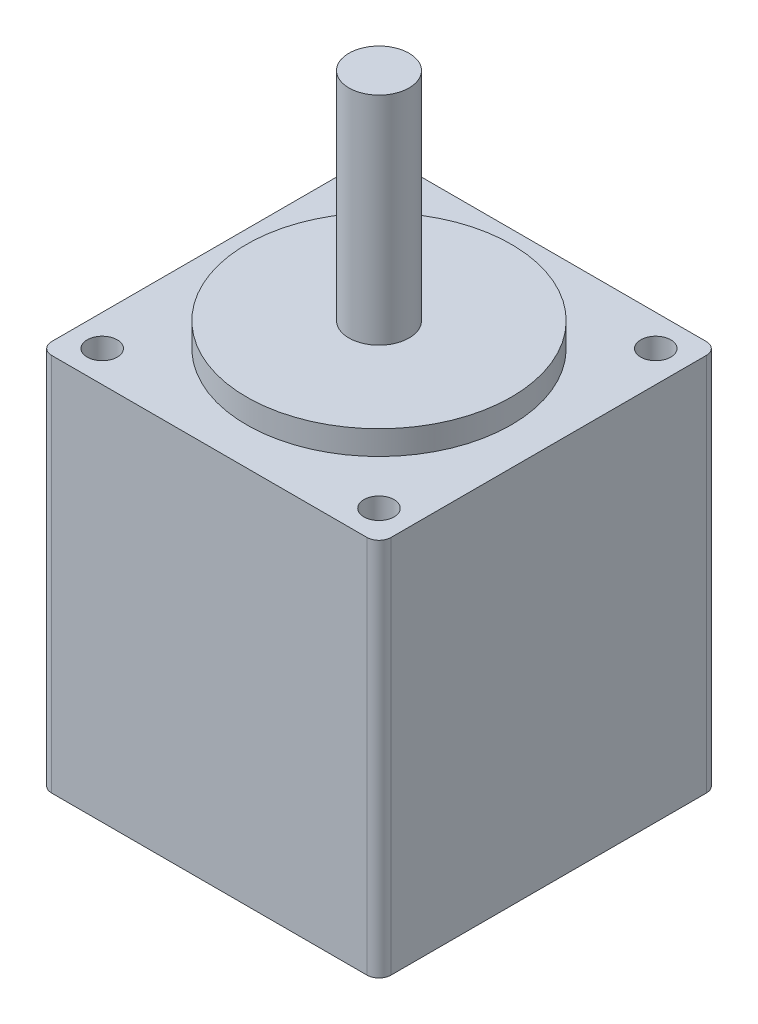
ISO-10303-21;
HEADER;
FILE_DESCRIPTION(('STEP AP214'),'2;1');
FILE_NAME('part.step','',(''),(''),'','','');
FILE_SCHEMA(('AUTOMOTIVE_DESIGN { 1 0 10303 214 1 1 1 1 }'));
ENDSEC;
DATA;
#1=APPLICATION_CONTEXT('core data for automotive mechanical design processes');
#2=APPLICATION_PROTOCOL_DEFINITION('international standard','automotive_design',2000,#1);
#3=PRODUCT_CONTEXT('',#1,'mechanical');
#4=PRODUCT('Part','Part','',(#3));
#5=PRODUCT_RELATED_PRODUCT_CATEGORY('part','',(#4));
#6=PRODUCT_DEFINITION_FORMATION('','',#4);
#7=PRODUCT_DEFINITION_CONTEXT('part definition',#1,'design');
#8=PRODUCT_DEFINITION('design','',#6,#7);
#9=PRODUCT_DEFINITION_SHAPE('','',#8);
#10=(LENGTH_UNIT() NAMED_UNIT(*) SI_UNIT(.MILLI.,.METRE.));
#11=(NAMED_UNIT(*) PLANE_ANGLE_UNIT() SI_UNIT($,.RADIAN.));
#12=(NAMED_UNIT(*) SI_UNIT($,.STERADIAN.) SOLID_ANGLE_UNIT());
#13=UNCERTAINTY_MEASURE_WITH_UNIT(LENGTH_MEASURE(1.E-05),#10,'distance_accuracy_value','');
#14=(GEOMETRIC_REPRESENTATION_CONTEXT(3) GLOBAL_UNCERTAINTY_ASSIGNED_CONTEXT((#13)) GLOBAL_UNIT_ASSIGNED_CONTEXT((#10,
#11,#12)) REPRESENTATION_CONTEXT('',''));
#15=CARTESIAN_POINT('',(0.,0.,0.));
#16=DIRECTION('',(0.,0.,1.));
#17=DIRECTION('',(1.,0.,0.));
#18=AXIS2_PLACEMENT_3D('',#15,#16,#17);
#19=CARTESIAN_POINT('',(0.,31.5,0.));
#20=DIRECTION('',(0.,1.,0.));
#21=DIRECTION('',(1.,0.,0.));
#22=AXIS2_PLACEMENT_3D('',#19,#20,#21);
#23=PLANE('',#22);
#24=CARTESIAN_POINT('',(0.,31.5,0.));
#25=DIRECTION('',(0.,-1.,0.));
#26=DIRECTION('',(-1.,0.,0.));
#27=AXIS2_PLACEMENT_3D('',#24,#25,#26);
#28=CIRCLE('',#27,11.);
#29=CARTESIAN_POINT('',(11.,31.5,0.));
#30=VERTEX_POINT('',#29);
#31=EDGE_CURVE('E199',#30,#30,#28,.T.);
#32=ORIENTED_EDGE('',*,*,#31,.T.);
#33=EDGE_LOOP('',(#32));
#34=FACE_BOUND('',#33,.T.);
#35=CARTESIAN_POINT('',(-11.5,31.5,11.5));
#36=DIRECTION('',(0.,-1.,0.));
#37=DIRECTION('',(-1.,0.,0.));
#38=AXIS2_PLACEMENT_3D('',#35,#36,#37);
#39=CIRCLE('',#38,1.25);
#40=CARTESIAN_POINT('',(-10.25,31.5,11.5));
#41=VERTEX_POINT('',#40);
#42=EDGE_CURVE('E268',#41,#41,#39,.T.);
#43=ORIENTED_EDGE('',*,*,#42,.T.);
#44=EDGE_LOOP('',(#43));
#45=FACE_BOUND('',#44,.T.);
#46=CARTESIAN_POINT('',(11.5,31.5,11.5));
#47=DIRECTION('',(0.,-1.,0.));
#48=DIRECTION('',(-1.,0.,0.));
#49=AXIS2_PLACEMENT_3D('',#46,#47,#48);
#50=CIRCLE('',#49,1.25);
#51=CARTESIAN_POINT('',(12.75,31.5,11.5));
#52=VERTEX_POINT('',#51);
#53=EDGE_CURVE('E214',#52,#52,#50,.T.);
#54=ORIENTED_EDGE('',*,*,#53,.T.);
#55=EDGE_LOOP('',(#54));
#56=FACE_BOUND('',#55,.T.);
#57=CARTESIAN_POINT('',(-11.5,31.5,-11.5));
#58=DIRECTION('',(0.,-1.,0.));
#59=DIRECTION('',(-1.,0.,0.));
#60=AXIS2_PLACEMENT_3D('',#57,#58,#59);
#61=CIRCLE('',#60,1.25);
#62=CARTESIAN_POINT('',(-10.25,31.5,-11.5));
#63=VERTEX_POINT('',#62);
#64=EDGE_CURVE('E232',#63,#63,#61,.T.);
#65=ORIENTED_EDGE('',*,*,#64,.T.);
#66=EDGE_LOOP('',(#65));
#67=FACE_BOUND('',#66,.T.);
#68=CARTESIAN_POINT('',(11.5,31.5,-11.5));
#69=DIRECTION('',(0.,-1.,0.));
#70=DIRECTION('',(-1.,0.,0.));
#71=AXIS2_PLACEMENT_3D('',#68,#69,#70);
#72=CIRCLE('',#71,1.25);
#73=CARTESIAN_POINT('',(12.75,31.5,-11.5));
#74=VERTEX_POINT('',#73);
#75=EDGE_CURVE('E220',#74,#74,#72,.T.);
#76=ORIENTED_EDGE('',*,*,#75,.T.);
#77=EDGE_LOOP('',(#76));
#78=FACE_BOUND('',#77,.T.);
#79=CARTESIAN_POINT('',(-13.1,31.5,-13.1));
#80=DIRECTION('',(0.,-1.,0.));
#81=DIRECTION('',(-0.707106781186548,0.,-0.707106781186548));
#82=AXIS2_PLACEMENT_3D('',#79,#80,#81);
#83=CIRCLE('',#82,1.);
#84=CARTESIAN_POINT('',(-14.1,31.5,-13.1));
#85=VERTEX_POINT('',#84);
#86=CARTESIAN_POINT('',(-13.1,31.5,-14.1));
#87=VERTEX_POINT('',#86);
#88=EDGE_CURVE('E227',#85,#87,#83,.T.);
#89=ORIENTED_EDGE('',*,*,#88,.F.);
#90=DIRECTION('',(0.,0.,1.));
#91=VECTOR('',#90,1.);
#92=CARTESIAN_POINT('',(-14.1,31.5,14.1));
#93=LINE('',#92,#91);
#94=CARTESIAN_POINT('',(-14.1,31.5,13.1));
#95=VERTEX_POINT('',#94);
#96=EDGE_CURVE('E209',#85,#95,#93,.T.);
#97=ORIENTED_EDGE('',*,*,#96,.T.);
#98=CARTESIAN_POINT('',(-13.1,31.5,13.1));
#99=DIRECTION('',(0.,-1.,0.));
#100=DIRECTION('',(-0.707106781186548,0.,0.707106781186548));
#101=AXIS2_PLACEMENT_3D('',#98,#99,#100);
#102=CIRCLE('',#101,1.);
#103=CARTESIAN_POINT('',(-13.1,31.5,14.1));
#104=VERTEX_POINT('',#103);
#105=EDGE_CURVE('E164',#104,#95,#102,.T.);
#106=ORIENTED_EDGE('',*,*,#105,.F.);
#107=DIRECTION('',(1.,0.,0.));
#108=VECTOR('',#107,1.);
#109=CARTESIAN_POINT('',(14.1,31.5,14.1));
#110=LINE('',#109,#108);
#111=CARTESIAN_POINT('',(13.1,31.5,14.1));
#112=VERTEX_POINT('',#111);
#113=EDGE_CURVE('E159',#104,#112,#110,.T.);
#114=ORIENTED_EDGE('',*,*,#113,.T.);
#115=CARTESIAN_POINT('',(13.1,31.5,13.1));
#116=DIRECTION('',(0.,-1.,0.));
#117=DIRECTION('',(0.707106781186548,0.,0.707106781186548));
#118=AXIS2_PLACEMENT_3D('',#115,#116,#117);
#119=CIRCLE('',#118,1.);
#120=CARTESIAN_POINT('',(14.1,31.5,13.1));
#121=VERTEX_POINT('',#120);
#122=EDGE_CURVE('E191',#121,#112,#119,.T.);
#123=ORIENTED_EDGE('',*,*,#122,.F.);
#124=DIRECTION('',(0.,0.,-1.));
#125=VECTOR('',#124,1.);
#126=CARTESIAN_POINT('',(14.1,31.5,-14.1));
#127=LINE('',#126,#125);
#128=CARTESIAN_POINT('',(14.1,31.5,-13.1));
#129=VERTEX_POINT('',#128);
#130=EDGE_CURVE('E11',#121,#129,#127,.T.);
#131=ORIENTED_EDGE('',*,*,#130,.T.);
#132=CARTESIAN_POINT('',(13.1,31.5,-13.1));
#133=DIRECTION('',(0.,-1.,0.));
#134=DIRECTION('',(0.707106781186548,0.,-0.707106781186548));
#135=AXIS2_PLACEMENT_3D('',#132,#133,#134);
#136=CIRCLE('',#135,1.);
#137=CARTESIAN_POINT('',(13.1,31.5,-14.1));
#138=VERTEX_POINT('',#137);
#139=EDGE_CURVE('E203',#138,#129,#136,.T.);
#140=ORIENTED_EDGE('',*,*,#139,.F.);
#141=DIRECTION('',(-1.,0.,0.));
#142=VECTOR('',#141,1.);
#143=CARTESIAN_POINT('',(-14.1,31.5,-14.1));
#144=LINE('',#143,#142);
#145=EDGE_CURVE('E194',#138,#87,#144,.T.);
#146=ORIENTED_EDGE('',*,*,#145,.T.);
#147=EDGE_LOOP('',(#89,#97,#106,#114,#123,#131,#140,#146));
#148=FACE_BOUND('',#147,.T.);
#149=ADVANCED_FACE('F17',(#34,#45,#56,#67,#78,#148),#23,.T.);
#150=CARTESIAN_POINT('',(14.1,0.,14.1));
#151=DIRECTION('',(1.,0.,0.));
#152=DIRECTION('',(0.,1.,0.));
#153=AXIS2_PLACEMENT_3D('',#150,#151,#152);
#154=PLANE('',#153);
#155=DIRECTION('',(0.,-1.,0.));
#156=VECTOR('',#155,1.);
#157=CARTESIAN_POINT('',(14.1,0.,-13.1));
#158=LINE('',#157,#156);
#159=CARTESIAN_POINT('',(14.1,0.,-13.1));
#160=VERTEX_POINT('',#159);
#161=EDGE_CURVE('E213',#129,#160,#158,.T.);
#162=ORIENTED_EDGE('',*,*,#161,.F.);
#163=ORIENTED_EDGE('',*,*,#130,.F.);
#164=DIRECTION('',(0.,1.,0.));
#165=VECTOR('',#164,1.);
#166=CARTESIAN_POINT('',(14.1,0.,13.1));
#167=LINE('',#166,#165);
#168=CARTESIAN_POINT('',(14.1,0.,13.1));
#169=VERTEX_POINT('',#168);
#170=EDGE_CURVE('E28',#169,#121,#167,.T.);
#171=ORIENTED_EDGE('',*,*,#170,.F.);
#172=DIRECTION('',(0.,0.,1.));
#173=VECTOR('',#172,1.);
#174=CARTESIAN_POINT('',(14.1,0.,-14.1));
#175=LINE('',#174,#173);
#176=EDGE_CURVE('E186',#160,#169,#175,.T.);
#177=ORIENTED_EDGE('',*,*,#176,.F.);
#178=EDGE_LOOP('',(#162,#163,#171,#177));
#179=FACE_BOUND('',#178,.T.);
#180=ADVANCED_FACE('F318',(#179),#154,.T.);
#181=CARTESIAN_POINT('',(13.1,0.,13.1));
#182=DIRECTION('',(0.,1.,0.));
#183=DIRECTION('',(0.707106781186548,0.,0.707106781186548));
#184=AXIS2_PLACEMENT_3D('',#181,#182,#183);
#185=CYLINDRICAL_SURFACE('',#184,1.);
#186=ORIENTED_EDGE('',*,*,#122,.T.);
#187=DIRECTION('',(0.,-1.,0.));
#188=VECTOR('',#187,1.);
#189=CARTESIAN_POINT('',(13.1,0.,14.1));
#190=LINE('',#189,#188);
#191=CARTESIAN_POINT('',(13.1,0.,14.1));
#192=VERTEX_POINT('',#191);
#193=EDGE_CURVE('E163',#112,#192,#190,.T.);
#194=ORIENTED_EDGE('',*,*,#193,.T.);
#195=CARTESIAN_POINT('',(13.1,0.,13.1));
#196=DIRECTION('',(0.,1.,0.));
#197=DIRECTION('',(0.707106781186548,0.,0.707106781186548));
#198=AXIS2_PLACEMENT_3D('',#195,#196,#197);
#199=CIRCLE('',#198,1.);
#200=EDGE_CURVE('E179',#192,#169,#199,.T.);
#201=ORIENTED_EDGE('',*,*,#200,.T.);
#202=ORIENTED_EDGE('',*,*,#170,.T.);
#203=EDGE_LOOP('',(#186,#194,#201,#202));
#204=FACE_BOUND('',#203,.T.);
#205=ADVANCED_FACE('F324',(#204),#185,.T.);
#206=CARTESIAN_POINT('',(14.1,0.,-14.1));
#207=DIRECTION('',(0.,0.,-1.));
#208=DIRECTION('',(0.,-1.,0.));
#209=AXIS2_PLACEMENT_3D('',#206,#207,#208);
#210=PLANE('',#209);
#211=DIRECTION('',(0.,-1.,0.));
#212=VECTOR('',#211,1.);
#213=CARTESIAN_POINT('',(-13.1,0.,-14.1));
#214=LINE('',#213,#212);
#215=CARTESIAN_POINT('',(-13.1,0.,-14.1));
#216=VERTEX_POINT('',#215);
#217=EDGE_CURVE('E231',#87,#216,#214,.T.);
#218=ORIENTED_EDGE('',*,*,#217,.F.);
#219=ORIENTED_EDGE('',*,*,#145,.F.);
#220=DIRECTION('',(0.,1.,0.));
#221=VECTOR('',#220,1.);
#222=CARTESIAN_POINT('',(13.1,0.,-14.1));
#223=LINE('',#222,#221);
#224=CARTESIAN_POINT('',(13.1,0.,-14.1));
#225=VERTEX_POINT('',#224);
#226=EDGE_CURVE('E21',#225,#138,#223,.T.);
#227=ORIENTED_EDGE('',*,*,#226,.F.);
#228=DIRECTION('',(1.,0.,0.));
#229=VECTOR('',#228,1.);
#230=CARTESIAN_POINT('',(-14.1,0.,-14.1));
#231=LINE('',#230,#229);
#232=EDGE_CURVE('E204',#216,#225,#231,.T.);
#233=ORIENTED_EDGE('',*,*,#232,.F.);
#234=EDGE_LOOP('',(#218,#219,#227,#233));
#235=FACE_BOUND('',#234,.T.);
#236=ADVANCED_FACE('F337',(#235),#210,.T.);
#237=CARTESIAN_POINT('',(13.1,0.,-13.1));
#238=DIRECTION('',(0.,1.,0.));
#239=DIRECTION('',(0.707106781186548,0.,-0.707106781186548));
#240=AXIS2_PLACEMENT_3D('',#237,#238,#239);
#241=CYLINDRICAL_SURFACE('',#240,1.);
#242=ORIENTED_EDGE('',*,*,#139,.T.);
#243=ORIENTED_EDGE('',*,*,#161,.T.);
#244=CARTESIAN_POINT('',(13.1,0.,-13.1));
#245=DIRECTION('',(0.,1.,0.));
#246=DIRECTION('',(0.707106781186548,0.,-0.707106781186548));
#247=AXIS2_PLACEMENT_3D('',#244,#245,#246);
#248=CIRCLE('',#247,1.);
#249=EDGE_CURVE('E208',#160,#225,#248,.T.);
#250=ORIENTED_EDGE('',*,*,#249,.T.);
#251=ORIENTED_EDGE('',*,*,#226,.T.);
#252=EDGE_LOOP('',(#242,#243,#250,#251));
#253=FACE_BOUND('',#252,.T.);
#254=ADVANCED_FACE('F339',(#253),#241,.T.);
#255=CARTESIAN_POINT('',(-14.1,0.,14.1));
#256=DIRECTION('',(0.,0.,1.));
#257=DIRECTION('',(1.,0.,0.));
#258=AXIS2_PLACEMENT_3D('',#255,#256,#257);
#259=PLANE('',#258);
#260=DIRECTION('',(0.,1.,0.));
#261=VECTOR('',#260,1.);
#262=CARTESIAN_POINT('',(-13.1,0.,14.1));
#263=LINE('',#262,#261);
#264=CARTESIAN_POINT('',(-13.1,0.,14.1));
#265=VERTEX_POINT('',#264);
#266=EDGE_CURVE('E151',#265,#104,#263,.T.);
#267=ORIENTED_EDGE('',*,*,#266,.F.);
#268=DIRECTION('',(-1.,0.,0.));
#269=VECTOR('',#268,1.);
#270=CARTESIAN_POINT('',(14.1,0.,14.1));
#271=LINE('',#270,#269);
#272=EDGE_CURVE('E156',#192,#265,#271,.T.);
#273=ORIENTED_EDGE('',*,*,#272,.F.);
#274=ORIENTED_EDGE('',*,*,#193,.F.);
#275=ORIENTED_EDGE('',*,*,#113,.F.);
#276=EDGE_LOOP('',(#267,#273,#274,#275));
#277=FACE_BOUND('',#276,.T.);
#278=ADVANCED_FACE('F153',(#277),#259,.T.);
#279=CARTESIAN_POINT('',(-13.1,0.,13.1));
#280=DIRECTION('',(0.,1.,0.));
#281=DIRECTION('',(-0.707106781186548,0.,0.707106781186548));
#282=AXIS2_PLACEMENT_3D('',#279,#280,#281);
#283=CYLINDRICAL_SURFACE('',#282,1.);
#284=ORIENTED_EDGE('',*,*,#105,.T.);
#285=DIRECTION('',(0.,-1.,0.));
#286=VECTOR('',#285,1.);
#287=CARTESIAN_POINT('',(-14.1,0.,13.1));
#288=LINE('',#287,#286);
#289=CARTESIAN_POINT('',(-14.1,0.,13.1));
#290=VERTEX_POINT('',#289);
#291=EDGE_CURVE('E171',#95,#290,#288,.T.);
#292=ORIENTED_EDGE('',*,*,#291,.T.);
#293=CARTESIAN_POINT('',(-13.1,0.,13.1));
#294=DIRECTION('',(0.,1.,0.));
#295=DIRECTION('',(-0.707106781186548,0.,0.707106781186548));
#296=AXIS2_PLACEMENT_3D('',#293,#294,#295);
#297=CIRCLE('',#296,1.);
#298=EDGE_CURVE('E168',#290,#265,#297,.T.);
#299=ORIENTED_EDGE('',*,*,#298,.T.);
#300=ORIENTED_EDGE('',*,*,#266,.T.);
#301=EDGE_LOOP('',(#284,#292,#299,#300));
#302=FACE_BOUND('',#301,.T.);
#303=ADVANCED_FACE('F169',(#302),#283,.T.);
#304=CARTESIAN_POINT('',(0.,0.,0.));
#305=DIRECTION('',(0.,1.,0.));
#306=DIRECTION('',(1.,0.,0.));
#307=AXIS2_PLACEMENT_3D('',#304,#305,#306);
#308=PLANE('',#307);
#309=CARTESIAN_POINT('',(-13.1,0.,-13.1));
#310=DIRECTION('',(0.,1.,0.));
#311=DIRECTION('',(-0.707106781186548,0.,-0.707106781186548));
#312=AXIS2_PLACEMENT_3D('',#309,#310,#311);
#313=CIRCLE('',#312,1.);
#314=CARTESIAN_POINT('',(-14.1,0.,-13.1));
#315=VERTEX_POINT('',#314);
#316=EDGE_CURVE('E287',#216,#315,#313,.T.);
#317=ORIENTED_EDGE('',*,*,#316,.F.);
#318=ORIENTED_EDGE('',*,*,#232,.T.);
#319=ORIENTED_EDGE('',*,*,#249,.F.);
#320=ORIENTED_EDGE('',*,*,#176,.T.);
#321=ORIENTED_EDGE('',*,*,#200,.F.);
#322=ORIENTED_EDGE('',*,*,#272,.T.);
#323=ORIENTED_EDGE('',*,*,#298,.F.);
#324=DIRECTION('',(0.,0.,-1.));
#325=VECTOR('',#324,1.);
#326=CARTESIAN_POINT('',(-14.1,0.,14.1));
#327=LINE('',#326,#325);
#328=EDGE_CURVE('E375',#290,#315,#327,.T.);
#329=ORIENTED_EDGE('',*,*,#328,.T.);
#330=EDGE_LOOP('',(#317,#318,#319,#320,#321,#322,#323,#329));
#331=FACE_BOUND('',#330,.T.);
#332=ADVANCED_FACE('F176',(#331),#308,.F.);
#333=CARTESIAN_POINT('',(-14.1,0.,-14.1));
#334=DIRECTION('',(-1.,0.,0.));
#335=DIRECTION('',(0.,0.,1.));
#336=AXIS2_PLACEMENT_3D('',#333,#334,#335);
#337=PLANE('',#336);
#338=DIRECTION('',(0.,1.,0.));
#339=VECTOR('',#338,1.);
#340=CARTESIAN_POINT('',(-14.1,0.,-13.1));
#341=LINE('',#340,#339);
#342=EDGE_CURVE('E257',#315,#85,#341,.T.);
#343=ORIENTED_EDGE('',*,*,#342,.F.);
#344=ORIENTED_EDGE('',*,*,#328,.F.);
#345=ORIENTED_EDGE('',*,*,#291,.F.);
#346=ORIENTED_EDGE('',*,*,#96,.F.);
#347=EDGE_LOOP('',(#343,#344,#345,#346));
#348=FACE_BOUND('',#347,.T.);
#349=ADVANCED_FACE('F331',(#348),#337,.T.);
#350=CARTESIAN_POINT('',(-13.1,0.,-13.1));
#351=DIRECTION('',(0.,1.,0.));
#352=DIRECTION('',(-0.707106781186548,0.,-0.707106781186548));
#353=AXIS2_PLACEMENT_3D('',#350,#351,#352);
#354=CYLINDRICAL_SURFACE('',#353,1.);
#355=ORIENTED_EDGE('',*,*,#88,.T.);
#356=ORIENTED_EDGE('',*,*,#217,.T.);
#357=ORIENTED_EDGE('',*,*,#316,.T.);
#358=ORIENTED_EDGE('',*,*,#342,.T.);
#359=EDGE_LOOP('',(#355,#356,#357,#358));
#360=FACE_BOUND('',#359,.T.);
#361=ADVANCED_FACE('F327',(#360),#354,.T.);
#362=CARTESIAN_POINT('',(0.,33.5,0.));
#363=DIRECTION('',(0.,1.,0.));
#364=DIRECTION('',(1.,0.,0.));
#365=AXIS2_PLACEMENT_3D('',#362,#363,#364);
#366=PLANE('',#365);
#367=CARTESIAN_POINT('',(0.,33.5,0.));
#368=DIRECTION('',(0.,-1.,0.));
#369=DIRECTION('',(-1.,0.,0.));
#370=AXIS2_PLACEMENT_3D('',#367,#368,#369);
#371=CIRCLE('',#370,2.5);
#372=CARTESIAN_POINT('',(2.5,33.5,0.));
#373=VERTEX_POINT('',#372);
#374=EDGE_CURVE('E128',#373,#373,#371,.T.);
#375=ORIENTED_EDGE('',*,*,#374,.T.);
#376=EDGE_LOOP('',(#375));
#377=FACE_BOUND('',#376,.T.);
#378=CARTESIAN_POINT('',(0.,33.5,0.));
#379=DIRECTION('',(0.,1.,0.));
#380=DIRECTION('',(-1.,0.,0.));
#381=AXIS2_PLACEMENT_3D('',#378,#379,#380);
#382=CIRCLE('',#381,11.);
#383=CARTESIAN_POINT('',(11.,33.5,0.));
#384=VERTEX_POINT('',#383);
#385=EDGE_CURVE('E200',#384,#384,#382,.T.);
#386=ORIENTED_EDGE('',*,*,#385,.T.);
#387=EDGE_LOOP('',(#386));
#388=FACE_BOUND('',#387,.T.);
#389=ADVANCED_FACE('F330',(#377,#388),#366,.T.);
#390=CARTESIAN_POINT('',(0.,31.5,0.));
#391=DIRECTION('',(0.,1.,0.));
#392=DIRECTION('',(-1.,0.,0.));
#393=AXIS2_PLACEMENT_3D('',#390,#391,#392);
#394=CYLINDRICAL_SURFACE('',#393,11.);
#395=ORIENTED_EDGE('',*,*,#385,.F.);
#396=DIRECTION('',(0.,-1.,0.));
#397=VECTOR('',#396,1.);
#398=CARTESIAN_POINT('',(11.,31.5,0.));
#399=LINE('',#398,#397);
#400=EDGE_CURVE('E195',#384,#30,#399,.T.);
#401=ORIENTED_EDGE('',*,*,#400,.T.);
#402=ORIENTED_EDGE('',*,*,#31,.F.);
#403=ORIENTED_EDGE('',*,*,#400,.F.);
#404=EDGE_LOOP('',(#395,#401,#402,#403));
#405=FACE_BOUND('',#404,.T.);
#406=ADVANCED_FACE('F346',(#405),#394,.T.);
#407=CARTESIAN_POINT('',(0.,51.5,0.));
#408=DIRECTION('',(0.,1.,0.));
#409=DIRECTION('',(1.,0.,0.));
#410=AXIS2_PLACEMENT_3D('',#407,#408,#409);
#411=PLANE('',#410);
#412=CARTESIAN_POINT('',(0.,51.5,0.));
#413=DIRECTION('',(0.,1.,0.));
#414=DIRECTION('',(-1.,0.,0.));
#415=AXIS2_PLACEMENT_3D('',#412,#413,#414);
#416=CIRCLE('',#415,2.5);
#417=CARTESIAN_POINT('',(2.5,51.5,0.));
#418=VERTEX_POINT('',#417);
#419=EDGE_CURVE('E272',#418,#418,#416,.T.);
#420=ORIENTED_EDGE('',*,*,#419,.T.);
#421=EDGE_LOOP('',(#420));
#422=FACE_BOUND('',#421,.T.);
#423=ADVANCED_FACE('F342',(#422),#411,.T.);
#424=CARTESIAN_POINT('',(0.,33.5,0.));
#425=DIRECTION('',(0.,1.,0.));
#426=DIRECTION('',(-1.,0.,0.));
#427=AXIS2_PLACEMENT_3D('',#424,#425,#426);
#428=CYLINDRICAL_SURFACE('',#427,2.5);
#429=ORIENTED_EDGE('',*,*,#419,.F.);
#430=DIRECTION('',(0.,-1.,0.));
#431=VECTOR('',#430,1.);
#432=CARTESIAN_POINT('',(2.5,33.5,0.));
#433=LINE('',#432,#431);
#434=EDGE_CURVE('E138',#418,#373,#433,.T.);
#435=ORIENTED_EDGE('',*,*,#434,.T.);
#436=ORIENTED_EDGE('',*,*,#374,.F.);
#437=ORIENTED_EDGE('',*,*,#434,.F.);
#438=EDGE_LOOP('',(#429,#435,#436,#437));
#439=FACE_BOUND('',#438,.T.);
#440=ADVANCED_FACE('F345',(#439),#428,.T.);
#441=CARTESIAN_POINT('',(-11.5,27.5,11.5));
#442=DIRECTION('',(0.,1.,0.));
#443=DIRECTION('',(1.,0.,0.));
#444=AXIS2_PLACEMENT_3D('',#441,#442,#443);
#445=PLANE('',#444);
#446=CARTESIAN_POINT('',(-11.5,27.5,11.5));
#447=DIRECTION('',(0.,-1.,0.));
#448=DIRECTION('',(-1.,0.,0.));
#449=AXIS2_PLACEMENT_3D('',#446,#447,#448);
#450=CIRCLE('',#449,1.25);
#451=CARTESIAN_POINT('',(-10.25,27.5,11.5));
#452=VERTEX_POINT('',#451);
#453=EDGE_CURVE('E267',#452,#452,#450,.T.);
#454=ORIENTED_EDGE('',*,*,#453,.F.);
#455=EDGE_LOOP('',(#454));
#456=FACE_BOUND('',#455,.T.);
#457=ADVANCED_FACE('F350',(#456),#445,.T.);
#458=CARTESIAN_POINT('',(-11.5,31.5,11.5));
#459=DIRECTION('',(0.,-1.,0.));
#460=DIRECTION('',(-1.,0.,0.));
#461=AXIS2_PLACEMENT_3D('',#458,#459,#460);
#462=CYLINDRICAL_SURFACE('',#461,1.25);
#463=ORIENTED_EDGE('',*,*,#42,.F.);
#464=DIRECTION('',(0.,-1.,0.));
#465=VECTOR('',#464,1.);
#466=CARTESIAN_POINT('',(-10.25,31.5,11.5));
#467=LINE('',#466,#465);
#468=EDGE_CURVE('E264',#41,#452,#467,.T.);
#469=ORIENTED_EDGE('',*,*,#468,.T.);
#470=ORIENTED_EDGE('',*,*,#453,.T.);
#471=ORIENTED_EDGE('',*,*,#468,.F.);
#472=EDGE_LOOP('',(#463,#469,#470,#471));
#473=FACE_BOUND('',#472,.T.);
#474=ADVANCED_FACE('F348',(#473),#462,.F.);
#475=CARTESIAN_POINT('',(11.5,27.5,11.5));
#476=DIRECTION('',(0.,1.,0.));
#477=DIRECTION('',(1.,0.,0.));
#478=AXIS2_PLACEMENT_3D('',#475,#476,#477);
#479=PLANE('',#478);
#480=CARTESIAN_POINT('',(11.5,27.5,11.5));
#481=DIRECTION('',(0.,-1.,0.));
#482=DIRECTION('',(-1.,0.,0.));
#483=AXIS2_PLACEMENT_3D('',#480,#481,#482);
#484=CIRCLE('',#483,1.25);
#485=CARTESIAN_POINT('',(12.75,27.5,11.5));
#486=VERTEX_POINT('',#485);
#487=EDGE_CURVE('E389',#486,#486,#484,.T.);
#488=ORIENTED_EDGE('',*,*,#487,.F.);
#489=EDGE_LOOP('',(#488));
#490=FACE_BOUND('',#489,.T.);
#491=ADVANCED_FACE('F312',(#490),#479,.T.);
#492=CARTESIAN_POINT('',(11.5,31.5,11.5));
#493=DIRECTION('',(0.,-1.,0.));
#494=DIRECTION('',(-1.,0.,0.));
#495=AXIS2_PLACEMENT_3D('',#492,#493,#494);
#496=CYLINDRICAL_SURFACE('',#495,1.25);
#497=ORIENTED_EDGE('',*,*,#53,.F.);
#498=DIRECTION('',(0.,-1.,0.));
#499=VECTOR('',#498,1.);
#500=CARTESIAN_POINT('',(12.75,31.5,11.5));
#501=LINE('',#500,#499);
#502=EDGE_CURVE('E218',#52,#486,#501,.T.);
#503=ORIENTED_EDGE('',*,*,#502,.T.);
#504=ORIENTED_EDGE('',*,*,#487,.T.);
#505=ORIENTED_EDGE('',*,*,#502,.F.);
#506=EDGE_LOOP('',(#497,#503,#504,#505));
#507=FACE_BOUND('',#506,.T.);
#508=ADVANCED_FACE('F302',(#507),#496,.F.);
#509=CARTESIAN_POINT('',(-11.5,27.5,-11.5));
#510=DIRECTION('',(0.,1.,0.));
#511=DIRECTION('',(1.,0.,0.));
#512=AXIS2_PLACEMENT_3D('',#509,#510,#511);
#513=PLANE('',#512);
#514=CARTESIAN_POINT('',(-11.5,27.5,-11.5));
#515=DIRECTION('',(0.,-1.,0.));
#516=DIRECTION('',(-1.,0.,0.));
#517=AXIS2_PLACEMENT_3D('',#514,#515,#516);
#518=CIRCLE('',#517,1.25);
#519=CARTESIAN_POINT('',(-10.25,27.5,-11.5));
#520=VERTEX_POINT('',#519);
#521=EDGE_CURVE('E219',#520,#520,#518,.T.);
#522=ORIENTED_EDGE('',*,*,#521,.F.);
#523=EDGE_LOOP('',(#522));
#524=FACE_BOUND('',#523,.T.);
#525=ADVANCED_FACE('F300',(#524),#513,.T.);
#526=CARTESIAN_POINT('',(-11.5,31.5,-11.5));
#527=DIRECTION('',(0.,-1.,0.));
#528=DIRECTION('',(-1.,0.,0.));
#529=AXIS2_PLACEMENT_3D('',#526,#527,#528);
#530=CYLINDRICAL_SURFACE('',#529,1.25);
#531=ORIENTED_EDGE('',*,*,#64,.F.);
#532=DIRECTION('',(0.,-1.,0.));
#533=VECTOR('',#532,1.);
#534=CARTESIAN_POINT('',(-10.25,31.5,-11.5));
#535=LINE('',#534,#533);
#536=EDGE_CURVE('E235',#63,#520,#535,.T.);
#537=ORIENTED_EDGE('',*,*,#536,.T.);
#538=ORIENTED_EDGE('',*,*,#521,.T.);
#539=ORIENTED_EDGE('',*,*,#536,.F.);
#540=EDGE_LOOP('',(#531,#537,#538,#539));
#541=FACE_BOUND('',#540,.T.);
#542=ADVANCED_FACE('F298',(#541),#530,.F.);
#543=CARTESIAN_POINT('',(11.5,27.5,-11.5));
#544=DIRECTION('',(0.,1.,0.));
#545=DIRECTION('',(1.,0.,0.));
#546=AXIS2_PLACEMENT_3D('',#543,#544,#545);
#547=PLANE('',#546);
#548=CARTESIAN_POINT('',(11.5,27.5,-11.5));
#549=DIRECTION('',(0.,-1.,0.));
#550=DIRECTION('',(-1.,0.,0.));
#551=AXIS2_PLACEMENT_3D('',#548,#549,#550);
#552=CIRCLE('',#551,1.25);
#553=CARTESIAN_POINT('',(12.75,27.5,-11.5));
#554=VERTEX_POINT('',#553);
#555=EDGE_CURVE('E236',#554,#554,#552,.T.);
#556=ORIENTED_EDGE('',*,*,#555,.F.);
#557=EDGE_LOOP('',(#556));
#558=FACE_BOUND('',#557,.T.);
#559=ADVANCED_FACE('F310',(#558),#547,.T.);
#560=CARTESIAN_POINT('',(11.5,31.5,-11.5));
#561=DIRECTION('',(0.,-1.,0.));
#562=DIRECTION('',(-1.,0.,0.));
#563=AXIS2_PLACEMENT_3D('',#560,#561,#562);
#564=CYLINDRICAL_SURFACE('',#563,1.25);
#565=ORIENTED_EDGE('',*,*,#75,.F.);
#566=DIRECTION('',(0.,-1.,0.));
#567=VECTOR('',#566,1.);
#568=CARTESIAN_POINT('',(12.75,31.5,-11.5));
#569=LINE('',#568,#567);
#570=EDGE_CURVE('E224',#74,#554,#569,.T.);
#571=ORIENTED_EDGE('',*,*,#570,.T.);
#572=ORIENTED_EDGE('',*,*,#555,.T.);
#573=ORIENTED_EDGE('',*,*,#570,.F.);
#574=EDGE_LOOP('',(#565,#571,#572,#573));
#575=FACE_BOUND('',#574,.T.);
#576=ADVANCED_FACE('F19',(#575),#564,.F.);
#577=CLOSED_SHELL('',(#149,#180,#205,#236,#254,#278,#303,#332,#349,#361,#389,#406,#423,#440,
#457,#474,#491,#508,#525,#542,#559,#576));
#578=MANIFOLD_SOLID_BREP('B1',#577);
#579=ADVANCED_BREP_SHAPE_REPRESENTATION('',(#18,#578),#14);
#580=SHAPE_DEFINITION_REPRESENTATION(#9,#579);
ENDSEC;
END-ISO-10303-21;
